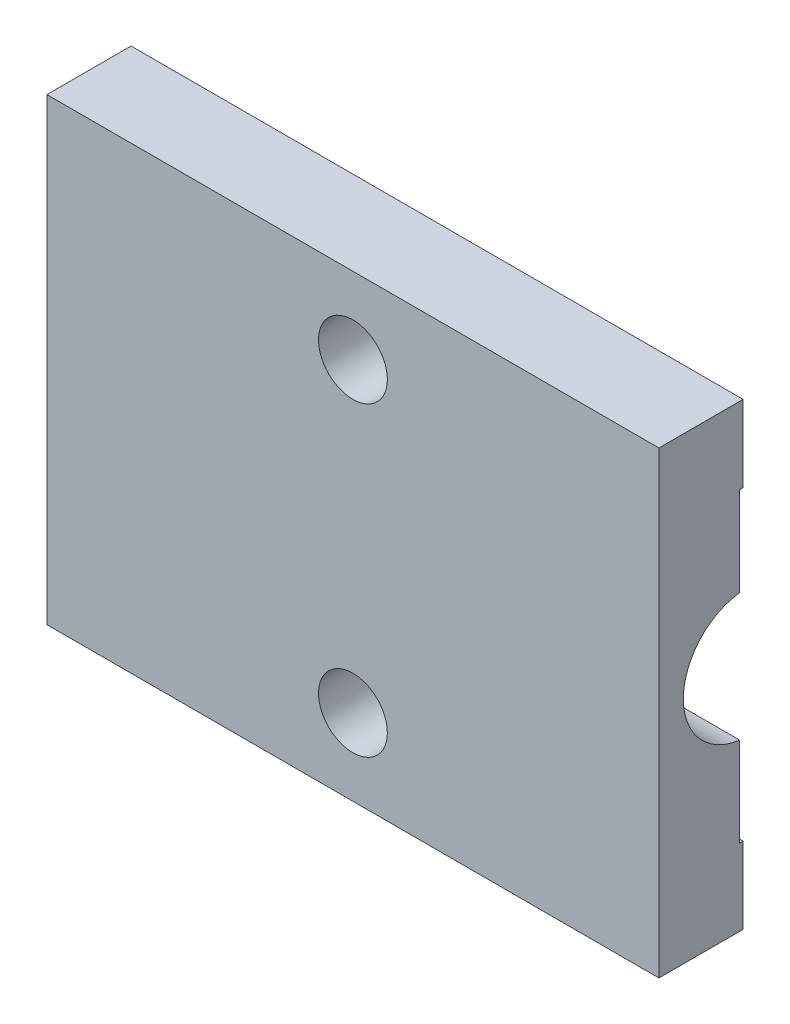
ISO-10303-21;
HEADER;
FILE_DESCRIPTION(('STEP AP214'),'2;1');
FILE_NAME('part.step','',(''),(''),'','','');
FILE_SCHEMA(('AUTOMOTIVE_DESIGN { 1 0 10303 214 1 1 1 1 }'));
ENDSEC;
DATA;
#1=APPLICATION_CONTEXT('core data for automotive mechanical design processes');
#2=APPLICATION_PROTOCOL_DEFINITION('international standard','automotive_design',2000,#1);
#3=PRODUCT_CONTEXT('',#1,'mechanical');
#4=PRODUCT('Part','Part','',(#3));
#5=PRODUCT_RELATED_PRODUCT_CATEGORY('part','',(#4));
#6=PRODUCT_DEFINITION_FORMATION('','',#4);
#7=PRODUCT_DEFINITION_CONTEXT('part definition',#1,'design');
#8=PRODUCT_DEFINITION('design','',#6,#7);
#9=PRODUCT_DEFINITION_SHAPE('','',#8);
#10=(LENGTH_UNIT() NAMED_UNIT(*) SI_UNIT(.MILLI.,.METRE.));
#11=(NAMED_UNIT(*) PLANE_ANGLE_UNIT() SI_UNIT($,.RADIAN.));
#12=(NAMED_UNIT(*) SI_UNIT($,.STERADIAN.) SOLID_ANGLE_UNIT());
#13=UNCERTAINTY_MEASURE_WITH_UNIT(LENGTH_MEASURE(1.E-05),#10,'distance_accuracy_value','');
#14=(GEOMETRIC_REPRESENTATION_CONTEXT(3) GLOBAL_UNCERTAINTY_ASSIGNED_CONTEXT((#13)) GLOBAL_UNIT_ASSIGNED_CONTEXT((#10,
#11,#12)) REPRESENTATION_CONTEXT('',''));
#15=CARTESIAN_POINT('',(0.,0.,0.));
#16=DIRECTION('',(0.,0.,1.));
#17=DIRECTION('',(1.,0.,0.));
#18=AXIS2_PLACEMENT_3D('',#15,#16,#17);
#19=CARTESIAN_POINT('',(0.,0.,0.));
#20=DIRECTION('',(0.,0.,-1.));
#21=DIRECTION('',(-1.,0.,0.));
#22=AXIS2_PLACEMENT_3D('',#19,#20,#21);
#23=PLANE('',#22);
#24=DIRECTION('',(1.,0.,0.));
#25=VECTOR('',#24,1.);
#26=CARTESIAN_POINT('',(0.,10.,0.));
#27=LINE('',#26,#25);
#28=CARTESIAN_POINT('',(10.0000000000002,10.,0.));
#29=VERTEX_POINT('',#28);
#30=CARTESIAN_POINT('',(20.0000000000002,10.,0.));
#31=VERTEX_POINT('',#30);
#32=EDGE_CURVE('E162',#29,#31,#27,.T.);
#33=ORIENTED_EDGE('',*,*,#32,.F.);
#34=DIRECTION('',(0.,-1.,0.));
#35=VECTOR('',#34,1.);
#36=CARTESIAN_POINT('',(10.0000000000002,0.,0.));
#37=LINE('',#36,#35);
#38=CARTESIAN_POINT('',(10.0000000000002,4.19428480196565,0.));
#39=VERTEX_POINT('',#38);
#40=EDGE_CURVE('E130',#29,#39,#37,.T.);
#41=ORIENTED_EDGE('',*,*,#40,.T.);
#42=DIRECTION('',(1.,0.,0.));
#43=VECTOR('',#42,1.);
#44=CARTESIAN_POINT('',(-19.9999999999998,4.19428480196565,0.));
#45=LINE('',#44,#43);
#46=CARTESIAN_POINT('',(-19.9999999999998,4.19428480196565,0.));
#47=VERTEX_POINT('',#46);
#48=EDGE_CURVE('E217',#47,#39,#45,.T.);
#49=ORIENTED_EDGE('',*,*,#48,.F.);
#50=DIRECTION('',(0.,-1.,0.));
#51=VECTOR('',#50,1.);
#52=CARTESIAN_POINT('',(-19.9999999999998,-14.9999999999999,0.));
#53=LINE('',#52,#51);
#54=CARTESIAN_POINT('',(-19.9999999999998,15.0000000000001,0.));
#55=VERTEX_POINT('',#54);
#56=EDGE_CURVE('E200',#55,#47,#53,.T.);
#57=ORIENTED_EDGE('',*,*,#56,.F.);
#58=DIRECTION('',(-1.,0.,0.));
#59=VECTOR('',#58,1.);
#60=CARTESIAN_POINT('',(-19.9999999999998,15.0000000000001,0.));
#61=LINE('',#60,#59);
#62=CARTESIAN_POINT('',(20.0000000000002,15.0000000000001,0.));
#63=VERTEX_POINT('',#62);
#64=EDGE_CURVE('E197',#63,#55,#61,.T.);
#65=ORIENTED_EDGE('',*,*,#64,.F.);
#66=DIRECTION('',(0.,1.,0.));
#67=VECTOR('',#66,1.);
#68=CARTESIAN_POINT('',(20.0000000000002,-14.9999999999999,0.));
#69=LINE('',#68,#67);
#70=EDGE_CURVE('E180',#31,#63,#69,.T.);
#71=ORIENTED_EDGE('',*,*,#70,.F.);
#72=EDGE_LOOP('',(#33,#41,#49,#57,#65,#71));
#73=FACE_BOUND('',#72,.T.);
#74=CARTESIAN_POINT('',(0.,10.0000000000001,0.));
#75=DIRECTION('',(0.,0.,1.));
#76=DIRECTION('',(1.,0.,0.));
#77=AXIS2_PLACEMENT_3D('',#74,#75,#76);
#78=CIRCLE('',#77,2.25);
#79=CARTESIAN_POINT('',(2.25,10.0000000000001,0.));
#80=VERTEX_POINT('',#79);
#81=EDGE_CURVE('E167',#80,#80,#78,.T.);
#82=ORIENTED_EDGE('',*,*,#81,.T.);
#83=EDGE_LOOP('',(#82));
#84=FACE_BOUND('',#83,.T.);
#85=ADVANCED_FACE('F39',(#73,#84),#23,.T.);
#86=CARTESIAN_POINT('',(20.0000000000002,-14.9999999999999,5.5));
#87=DIRECTION('',(-1.,0.,0.));
#88=DIRECTION('',(0.,0.,1.));
#89=AXIS2_PLACEMENT_3D('',#86,#87,#88);
#90=PLANE('',#89);
#91=CARTESIAN_POINT('',(20.0000000000002,-14.9999999999999,0.));
#92=VERTEX_POINT('',#91);
#93=CARTESIAN_POINT('',(20.0000000000002,-10.,0.));
#94=VERTEX_POINT('',#93);
#95=EDGE_CURVE('E194',#92,#94,#69,.T.);
#96=ORIENTED_EDGE('',*,*,#95,.T.);
#97=DIRECTION('',(0.,0.,-1.));
#98=VECTOR('',#97,1.);
#99=CARTESIAN_POINT('',(20.0000000000002,-10.,0.224999999999999));
#100=LINE('',#99,#98);
#101=CARTESIAN_POINT('',(20.0000000000002,-10.,0.224999999999999));
#102=VERTEX_POINT('',#101);
#103=EDGE_CURVE('E134',#102,#94,#100,.T.);
#104=ORIENTED_EDGE('',*,*,#103,.F.);
#105=DIRECTION('',(0.,-1.,0.));
#106=VECTOR('',#105,1.);
#107=CARTESIAN_POINT('',(20.0000000000002,10.,0.225000000000001));
#108=LINE('',#107,#106);
#109=CARTESIAN_POINT('',(20.0000000000002,-4.17209779367646,0.225));
#110=VERTEX_POINT('',#109);
#111=EDGE_CURVE('E154',#110,#102,#108,.T.);
#112=ORIENTED_EDGE('',*,*,#111,.F.);
#113=CARTESIAN_POINT('',(20.0000000000002,0.,-0.3));
#114=DIRECTION('',(1.,0.,0.));
#115=DIRECTION('',(0.,0.,-1.));
#116=AXIS2_PLACEMENT_3D('',#113,#114,#115);
#117=CIRCLE('',#116,4.205);
#118=CARTESIAN_POINT('',(20.0000000000002,4.17209779367646,0.225000000000001));
#119=VERTEX_POINT('',#118);
#120=EDGE_CURVE('E176',#119,#110,#117,.T.);
#121=ORIENTED_EDGE('',*,*,#120,.F.);
#122=CARTESIAN_POINT('',(20.0000000000002,10.,0.225000000000001));
#123=VERTEX_POINT('',#122);
#124=EDGE_CURVE('E155',#123,#119,#108,.T.);
#125=ORIENTED_EDGE('',*,*,#124,.F.);
#126=DIRECTION('',(0.,0.,1.));
#127=VECTOR('',#126,1.);
#128=CARTESIAN_POINT('',(20.0000000000002,10.,0.225000000000001));
#129=LINE('',#128,#127);
#130=EDGE_CURVE('E140',#31,#123,#129,.T.);
#131=ORIENTED_EDGE('',*,*,#130,.F.);
#132=ORIENTED_EDGE('',*,*,#70,.T.);
#133=DIRECTION('',(0.,0.,-1.));
#134=VECTOR('',#133,1.);
#135=CARTESIAN_POINT('',(20.0000000000002,15.0000000000001,5.5));
#136=LINE('',#135,#134);
#137=CARTESIAN_POINT('',(20.0000000000002,15.0000000000001,5.5));
#138=VERTEX_POINT('',#137);
#139=EDGE_CURVE('E212',#138,#63,#136,.T.);
#140=ORIENTED_EDGE('',*,*,#139,.F.);
#141=DIRECTION('',(0.,1.,0.));
#142=VECTOR('',#141,1.);
#143=CARTESIAN_POINT('',(20.0000000000002,-14.9999999999999,5.5));
#144=LINE('',#143,#142);
#145=CARTESIAN_POINT('',(20.0000000000002,-14.9999999999999,5.5));
#146=VERTEX_POINT('',#145);
#147=EDGE_CURVE('E183',#146,#138,#144,.T.);
#148=ORIENTED_EDGE('',*,*,#147,.F.);
#149=DIRECTION('',(0.,0.,-1.));
#150=VECTOR('',#149,1.);
#151=CARTESIAN_POINT('',(20.0000000000002,-14.9999999999999,5.5));
#152=LINE('',#151,#150);
#153=EDGE_CURVE('E193',#146,#92,#152,.T.);
#154=ORIENTED_EDGE('',*,*,#153,.T.);
#155=EDGE_LOOP('',(#96,#104,#112,#121,#125,#131,#132,#140,#148,#154));
#156=FACE_BOUND('',#155,.T.);
#157=ADVANCED_FACE('F41',(#156),#90,.F.);
#158=CARTESIAN_POINT('',(-19.9999999999998,15.0000000000001,5.5));
#159=DIRECTION('',(0.,-1.,0.));
#160=DIRECTION('',(0.,0.,-1.));
#161=AXIS2_PLACEMENT_3D('',#158,#159,#160);
#162=PLANE('',#161);
#163=ORIENTED_EDGE('',*,*,#64,.T.);
#164=DIRECTION('',(0.,0.,-1.));
#165=VECTOR('',#164,1.);
#166=CARTESIAN_POINT('',(-19.9999999999998,15.0000000000001,5.5));
#167=LINE('',#166,#165);
#168=CARTESIAN_POINT('',(-19.9999999999998,15.0000000000001,5.5));
#169=VERTEX_POINT('',#168);
#170=EDGE_CURVE('E209',#169,#55,#167,.T.);
#171=ORIENTED_EDGE('',*,*,#170,.F.);
#172=DIRECTION('',(-1.,0.,0.));
#173=VECTOR('',#172,1.);
#174=CARTESIAN_POINT('',(-19.9999999999998,15.0000000000001,5.5));
#175=LINE('',#174,#173);
#176=EDGE_CURVE('E186',#138,#169,#175,.T.);
#177=ORIENTED_EDGE('',*,*,#176,.F.);
#178=ORIENTED_EDGE('',*,*,#139,.T.);
#179=EDGE_LOOP('',(#163,#171,#177,#178));
#180=FACE_BOUND('',#179,.T.);
#181=ADVANCED_FACE('F266',(#180),#162,.F.);
#182=CARTESIAN_POINT('',(-19.9999999999998,-14.9999999999999,5.5));
#183=DIRECTION('',(1.,0.,0.));
#184=DIRECTION('',(0.,0.,-1.));
#185=AXIS2_PLACEMENT_3D('',#182,#183,#184);
#186=PLANE('',#185);
#187=ORIENTED_EDGE('',*,*,#56,.T.);
#188=CARTESIAN_POINT('',(-19.9999999999998,0.,-0.3));
#189=DIRECTION('',(1.,0.,0.));
#190=DIRECTION('',(0.,0.,-1.));
#191=AXIS2_PLACEMENT_3D('',#188,#189,#190);
#192=CIRCLE('',#191,4.205);
#193=CARTESIAN_POINT('',(-19.9999999999998,-4.19428480196565,0.));
#194=VERTEX_POINT('',#193);
#195=EDGE_CURVE('E177',#47,#194,#192,.T.);
#196=ORIENTED_EDGE('',*,*,#195,.T.);
#197=CARTESIAN_POINT('',(-19.9999999999998,-14.9999999999999,0.));
#198=VERTEX_POINT('',#197);
#199=EDGE_CURVE('E199',#194,#198,#53,.T.);
#200=ORIENTED_EDGE('',*,*,#199,.T.);
#201=DIRECTION('',(0.,0.,-1.));
#202=VECTOR('',#201,1.);
#203=CARTESIAN_POINT('',(-19.9999999999998,-14.9999999999999,5.5));
#204=LINE('',#203,#202);
#205=CARTESIAN_POINT('',(-19.9999999999998,-14.9999999999999,5.5));
#206=VERTEX_POINT('',#205);
#207=EDGE_CURVE('E206',#206,#198,#204,.T.);
#208=ORIENTED_EDGE('',*,*,#207,.F.);
#209=DIRECTION('',(0.,-1.,0.));
#210=VECTOR('',#209,1.);
#211=CARTESIAN_POINT('',(-19.9999999999998,-14.9999999999999,5.5));
#212=LINE('',#211,#210);
#213=EDGE_CURVE('E189',#169,#206,#212,.T.);
#214=ORIENTED_EDGE('',*,*,#213,.F.);
#215=ORIENTED_EDGE('',*,*,#170,.T.);
#216=EDGE_LOOP('',(#187,#196,#200,#208,#214,#215));
#217=FACE_BOUND('',#216,.T.);
#218=ADVANCED_FACE('F246',(#217),#186,.F.);
#219=CARTESIAN_POINT('',(-19.9999999999998,-14.9999999999999,5.5));
#220=DIRECTION('',(0.,1.,0.));
#221=DIRECTION('',(0.,0.,1.));
#222=AXIS2_PLACEMENT_3D('',#219,#220,#221);
#223=PLANE('',#222);
#224=DIRECTION('',(1.,0.,0.));
#225=VECTOR('',#224,1.);
#226=CARTESIAN_POINT('',(-19.9999999999998,-14.9999999999999,0.));
#227=LINE('',#226,#225);
#228=EDGE_CURVE('E187',#198,#92,#227,.T.);
#229=ORIENTED_EDGE('',*,*,#228,.T.);
#230=ORIENTED_EDGE('',*,*,#153,.F.);
#231=DIRECTION('',(1.,0.,0.));
#232=VECTOR('',#231,1.);
#233=CARTESIAN_POINT('',(-19.9999999999998,-14.9999999999999,5.5));
#234=LINE('',#233,#232);
#235=EDGE_CURVE('E191',#206,#146,#234,.T.);
#236=ORIENTED_EDGE('',*,*,#235,.F.);
#237=ORIENTED_EDGE('',*,*,#207,.T.);
#238=EDGE_LOOP('',(#229,#230,#236,#237));
#239=FACE_BOUND('',#238,.T.);
#240=ADVANCED_FACE('F260',(#239),#223,.F.);
#241=CARTESIAN_POINT('',(0.,0.,5.5));
#242=DIRECTION('',(0.,0.,-1.));
#243=DIRECTION('',(-1.,0.,0.));
#244=AXIS2_PLACEMENT_3D('',#241,#242,#243);
#245=PLANE('',#244);
#246=CARTESIAN_POINT('',(0.,10.0000000000001,5.5));
#247=DIRECTION('',(0.,0.,1.));
#248=DIRECTION('',(1.,0.,0.));
#249=AXIS2_PLACEMENT_3D('',#246,#247,#248);
#250=CIRCLE('',#249,2.25);
#251=CARTESIAN_POINT('',(2.25,10.0000000000001,5.5));
#252=VERTEX_POINT('',#251);
#253=EDGE_CURVE('E164',#252,#252,#250,.T.);
#254=ORIENTED_EDGE('',*,*,#253,.F.);
#255=EDGE_LOOP('',(#254));
#256=FACE_BOUND('',#255,.T.);
#257=CARTESIAN_POINT('',(0.,-9.9999999999999,5.5));
#258=DIRECTION('',(0.,0.,1.));
#259=DIRECTION('',(1.,0.,0.));
#260=AXIS2_PLACEMENT_3D('',#257,#258,#259);
#261=CIRCLE('',#260,2.25);
#262=CARTESIAN_POINT('',(2.25,-9.9999999999999,5.5));
#263=VERTEX_POINT('',#262);
#264=EDGE_CURVE('E170',#263,#263,#261,.T.);
#265=ORIENTED_EDGE('',*,*,#264,.F.);
#266=EDGE_LOOP('',(#265));
#267=FACE_BOUND('',#266,.T.);
#268=ORIENTED_EDGE('',*,*,#147,.T.);
#269=ORIENTED_EDGE('',*,*,#176,.T.);
#270=ORIENTED_EDGE('',*,*,#213,.T.);
#271=ORIENTED_EDGE('',*,*,#235,.T.);
#272=EDGE_LOOP('',(#268,#269,#270,#271));
#273=FACE_BOUND('',#272,.T.);
#274=ADVANCED_FACE('F263',(#256,#267,#273),#245,.F.);
#275=DIRECTION('',(-1.,0.,0.));
#276=VECTOR('',#275,1.);
#277=CARTESIAN_POINT('',(0.,-10.,0.));
#278=LINE('',#277,#276);
#279=CARTESIAN_POINT('',(10.0000000000002,-10.,0.));
#280=VERTEX_POINT('',#279);
#281=EDGE_CURVE('E11',#94,#280,#278,.T.);
#282=ORIENTED_EDGE('',*,*,#281,.F.);
#283=ORIENTED_EDGE('',*,*,#95,.F.);
#284=ORIENTED_EDGE('',*,*,#228,.F.);
#285=ORIENTED_EDGE('',*,*,#199,.F.);
#286=DIRECTION('',(1.,0.,0.));
#287=VECTOR('',#286,1.);
#288=CARTESIAN_POINT('',(-19.9999999999998,-4.19428480196565,0.));
#289=LINE('',#288,#287);
#290=CARTESIAN_POINT('',(10.0000000000002,-4.19428480196565,0.));
#291=VERTEX_POINT('',#290);
#292=EDGE_CURVE('E215',#291,#194,#289,.F.);
#293=ORIENTED_EDGE('',*,*,#292,.F.);
#294=DIRECTION('',(0.,-1.,0.));
#295=VECTOR('',#294,1.);
#296=CARTESIAN_POINT('',(10.0000000000002,0.,0.));
#297=LINE('',#296,#295);
#298=EDGE_CURVE('E62',#291,#280,#297,.T.);
#299=ORIENTED_EDGE('',*,*,#298,.T.);
#300=EDGE_LOOP('',(#282,#283,#284,#285,#293,#299));
#301=FACE_BOUND('',#300,.T.);
#302=CARTESIAN_POINT('',(0.,-9.9999999999999,0.));
#303=DIRECTION('',(0.,0.,1.));
#304=DIRECTION('',(1.,0.,0.));
#305=AXIS2_PLACEMENT_3D('',#302,#303,#304);
#306=CIRCLE('',#305,2.25);
#307=CARTESIAN_POINT('',(2.25,-9.9999999999999,0.));
#308=VERTEX_POINT('',#307);
#309=EDGE_CURVE('E173',#308,#308,#306,.T.);
#310=ORIENTED_EDGE('',*,*,#309,.T.);
#311=EDGE_LOOP('',(#310));
#312=FACE_BOUND('',#311,.T.);
#313=ADVANCED_FACE('F238',(#301,#312),#23,.T.);
#314=CARTESIAN_POINT('',(-19.9999999999998,0.,-0.3));
#315=DIRECTION('',(1.,0.,0.));
#316=DIRECTION('',(0.,0.,-1.));
#317=AXIS2_PLACEMENT_3D('',#314,#315,#316);
#318=CYLINDRICAL_SURFACE('',#317,4.205);
#319=ORIENTED_EDGE('',*,*,#120,.T.);
#320=DIRECTION('',(1.,0.,0.));
#321=VECTOR('',#320,1.);
#322=CARTESIAN_POINT('',(-19.9999999999998,-4.17209779367646,0.225));
#323=LINE('',#322,#321);
#324=CARTESIAN_POINT('',(10.0000000000002,-4.17209779367646,0.225));
#325=VERTEX_POINT('',#324);
#326=EDGE_CURVE('E47',#110,#325,#323,.F.);
#327=ORIENTED_EDGE('',*,*,#326,.T.);
#328=CARTESIAN_POINT('',(10.0000000000002,0.,-0.3));
#329=DIRECTION('',(1.,0.,0.));
#330=DIRECTION('',(0.,0.,-1.));
#331=AXIS2_PLACEMENT_3D('',#328,#329,#330);
#332=CIRCLE('',#331,4.205);
#333=EDGE_CURVE('E222',#291,#325,#332,.F.);
#334=ORIENTED_EDGE('',*,*,#333,.F.);
#335=ORIENTED_EDGE('',*,*,#292,.T.);
#336=ORIENTED_EDGE('',*,*,#195,.F.);
#337=ORIENTED_EDGE('',*,*,#48,.T.);
#338=CARTESIAN_POINT('',(10.0000000000002,4.17209779367646,0.225000000000001));
#339=VERTEX_POINT('',#338);
#340=EDGE_CURVE('E220',#339,#39,#332,.F.);
#341=ORIENTED_EDGE('',*,*,#340,.F.);
#342=DIRECTION('',(1.,0.,0.));
#343=VECTOR('',#342,1.);
#344=CARTESIAN_POINT('',(-19.9999999999998,4.17209779367646,0.225000000000001));
#345=LINE('',#344,#343);
#346=EDGE_CURVE('E148',#339,#119,#345,.T.);
#347=ORIENTED_EDGE('',*,*,#346,.T.);
#348=EDGE_LOOP('',(#319,#327,#334,#335,#336,#337,#341,#347));
#349=FACE_BOUND('',#348,.T.);
#350=ADVANCED_FACE('F243',(#349),#318,.F.);
#351=CARTESIAN_POINT('',(0.,-9.9999999999999,5.5));
#352=DIRECTION('',(0.,0.,1.));
#353=DIRECTION('',(1.,0.,0.));
#354=AXIS2_PLACEMENT_3D('',#351,#352,#353);
#355=CYLINDRICAL_SURFACE('',#354,2.25);
#356=ORIENTED_EDGE('',*,*,#309,.F.);
#357=EDGE_LOOP('',(#356));
#358=FACE_BOUND('',#357,.T.);
#359=ORIENTED_EDGE('',*,*,#264,.T.);
#360=EDGE_LOOP('',(#359));
#361=FACE_BOUND('',#360,.T.);
#362=ADVANCED_FACE('F285',(#358,#361),#355,.F.);
#363=CARTESIAN_POINT('',(0.,10.0000000000001,5.5));
#364=DIRECTION('',(0.,0.,1.));
#365=DIRECTION('',(1.,0.,0.));
#366=AXIS2_PLACEMENT_3D('',#363,#364,#365);
#367=CYLINDRICAL_SURFACE('',#366,2.25);
#368=ORIENTED_EDGE('',*,*,#81,.F.);
#369=EDGE_LOOP('',(#368));
#370=FACE_BOUND('',#369,.T.);
#371=ORIENTED_EDGE('',*,*,#253,.T.);
#372=EDGE_LOOP('',(#371));
#373=FACE_BOUND('',#372,.T.);
#374=ADVANCED_FACE('F296',(#370,#373),#367,.F.);
#375=CARTESIAN_POINT('',(10.0000000000002,0.,0.));
#376=DIRECTION('',(1.,0.,0.));
#377=DIRECTION('',(0.,0.,-1.));
#378=AXIS2_PLACEMENT_3D('',#375,#376,#377);
#379=PLANE('',#378);
#380=DIRECTION('',(0.,0.,1.));
#381=VECTOR('',#380,1.);
#382=CARTESIAN_POINT('',(10.0000000000002,10.,0.225000000000001));
#383=LINE('',#382,#381);
#384=CARTESIAN_POINT('',(10.0000000000002,10.,0.225000000000001));
#385=VERTEX_POINT('',#384);
#386=EDGE_CURVE('E126',#29,#385,#383,.T.);
#387=ORIENTED_EDGE('',*,*,#386,.T.);
#388=DIRECTION('',(0.,-1.,0.));
#389=VECTOR('',#388,1.);
#390=CARTESIAN_POINT('',(10.0000000000002,10.,0.225000000000001));
#391=LINE('',#390,#389);
#392=EDGE_CURVE('E54',#385,#339,#391,.T.);
#393=ORIENTED_EDGE('',*,*,#392,.T.);
#394=ORIENTED_EDGE('',*,*,#340,.T.);
#395=ORIENTED_EDGE('',*,*,#40,.F.);
#396=EDGE_LOOP('',(#387,#393,#394,#395));
#397=FACE_BOUND('',#396,.T.);
#398=ADVANCED_FACE('F128',(#397),#379,.T.);
#399=CARTESIAN_POINT('',(10.0000000000002,10.,0.225000000000001));
#400=DIRECTION('',(0.,0.,1.));
#401=DIRECTION('',(0.,-1.,0.));
#402=AXIS2_PLACEMENT_3D('',#399,#400,#401);
#403=PLANE('',#402);
#404=ORIENTED_EDGE('',*,*,#392,.F.);
#405=DIRECTION('',(1.,0.,0.));
#406=VECTOR('',#405,1.);
#407=CARTESIAN_POINT('',(10.0000000000002,10.,0.225000000000001));
#408=LINE('',#407,#406);
#409=EDGE_CURVE('E137',#385,#123,#408,.T.);
#410=ORIENTED_EDGE('',*,*,#409,.T.);
#411=ORIENTED_EDGE('',*,*,#124,.T.);
#412=ORIENTED_EDGE('',*,*,#346,.F.);
#413=EDGE_LOOP('',(#404,#410,#411,#412));
#414=FACE_BOUND('',#413,.T.);
#415=ADVANCED_FACE('F146',(#414),#403,.F.);
#416=CARTESIAN_POINT('',(10.0000000000002,10.,0.225000000000001));
#417=DIRECTION('',(0.,1.,0.));
#418=DIRECTION('',(0.,0.,1.));
#419=AXIS2_PLACEMENT_3D('',#416,#417,#418);
#420=PLANE('',#419);
#421=ORIENTED_EDGE('',*,*,#32,.T.);
#422=ORIENTED_EDGE('',*,*,#130,.T.);
#423=ORIENTED_EDGE('',*,*,#409,.F.);
#424=ORIENTED_EDGE('',*,*,#386,.F.);
#425=EDGE_LOOP('',(#421,#422,#423,#424));
#426=FACE_BOUND('',#425,.T.);
#427=ADVANCED_FACE('F138',(#426),#420,.F.);
#428=ORIENTED_EDGE('',*,*,#111,.T.);
#429=DIRECTION('',(1.,0.,0.));
#430=VECTOR('',#429,1.);
#431=CARTESIAN_POINT('',(10.0000000000002,-10.,0.224999999999999));
#432=LINE('',#431,#430);
#433=CARTESIAN_POINT('',(10.0000000000002,-10.,0.224999999999999));
#434=VERTEX_POINT('',#433);
#435=EDGE_CURVE('E143',#434,#102,#432,.T.);
#436=ORIENTED_EDGE('',*,*,#435,.F.);
#437=EDGE_CURVE('E133',#325,#434,#391,.T.);
#438=ORIENTED_EDGE('',*,*,#437,.F.);
#439=ORIENTED_EDGE('',*,*,#326,.F.);
#440=EDGE_LOOP('',(#428,#436,#438,#439));
#441=FACE_BOUND('',#440,.T.);
#442=ADVANCED_FACE('F230',(#441),#403,.F.);
#443=ORIENTED_EDGE('',*,*,#333,.T.);
#444=ORIENTED_EDGE('',*,*,#437,.T.);
#445=DIRECTION('',(0.,0.,-1.));
#446=VECTOR('',#445,1.);
#447=CARTESIAN_POINT('',(10.0000000000002,-10.,0.224999999999999));
#448=LINE('',#447,#446);
#449=EDGE_CURVE('E144',#434,#280,#448,.T.);
#450=ORIENTED_EDGE('',*,*,#449,.T.);
#451=ORIENTED_EDGE('',*,*,#298,.F.);
#452=EDGE_LOOP('',(#443,#444,#450,#451));
#453=FACE_BOUND('',#452,.T.);
#454=ADVANCED_FACE('F226',(#453),#379,.T.);
#455=CARTESIAN_POINT('',(10.0000000000002,-10.,0.224999999999999));
#456=DIRECTION('',(0.,-1.,0.));
#457=DIRECTION('',(0.,0.,-1.));
#458=AXIS2_PLACEMENT_3D('',#455,#456,#457);
#459=PLANE('',#458);
#460=ORIENTED_EDGE('',*,*,#281,.T.);
#461=ORIENTED_EDGE('',*,*,#449,.F.);
#462=ORIENTED_EDGE('',*,*,#435,.T.);
#463=ORIENTED_EDGE('',*,*,#103,.T.);
#464=EDGE_LOOP('',(#460,#461,#462,#463));
#465=FACE_BOUND('',#464,.T.);
#466=ADVANCED_FACE('F235',(#465),#459,.F.);
#467=CLOSED_SHELL('',(#85,#157,#181,#218,#240,#274,#313,#350,#362,#374,#398,#415,#427,#442,#454,#466));
#468=MANIFOLD_SOLID_BREP('B2',#467);
#469=ADVANCED_BREP_SHAPE_REPRESENTATION('',(#18,#468),#14);
#470=SHAPE_DEFINITION_REPRESENTATION(#9,#469);
ENDSEC;
END-ISO-10303-21;
